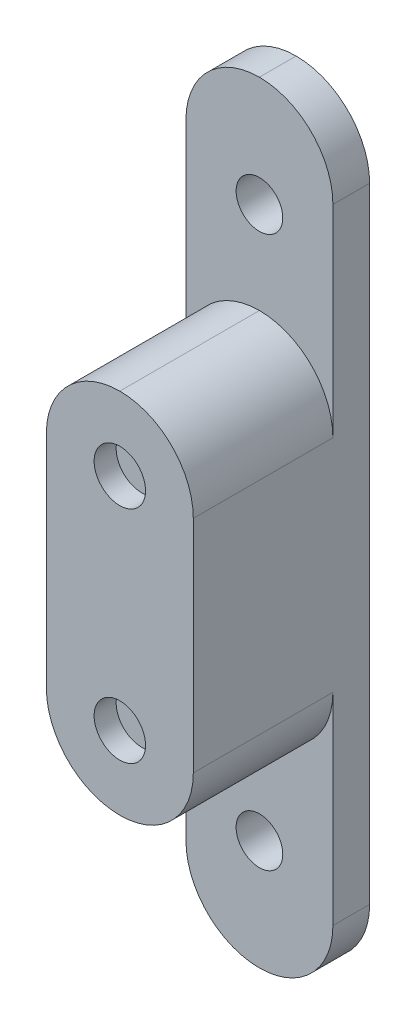
ISO-10303-21;
HEADER;
FILE_DESCRIPTION(('STEP AP214'),'2;1');
FILE_NAME('part.step','',(''),(''),'','','');
FILE_SCHEMA(('AUTOMOTIVE_DESIGN { 1 0 10303 214 1 1 1 1 }'));
ENDSEC;
DATA;
#1=APPLICATION_CONTEXT('core data for automotive mechanical design processes');
#2=APPLICATION_PROTOCOL_DEFINITION('international standard','automotive_design',2000,#1);
#3=PRODUCT_CONTEXT('',#1,'mechanical');
#4=PRODUCT('Part','Part','',(#3));
#5=PRODUCT_RELATED_PRODUCT_CATEGORY('part','',(#4));
#6=PRODUCT_DEFINITION_FORMATION('','',#4);
#7=PRODUCT_DEFINITION_CONTEXT('part definition',#1,'design');
#8=PRODUCT_DEFINITION('design','',#6,#7);
#9=PRODUCT_DEFINITION_SHAPE('','',#8);
#10=(LENGTH_UNIT() NAMED_UNIT(*) SI_UNIT(.MILLI.,.METRE.));
#11=(NAMED_UNIT(*) PLANE_ANGLE_UNIT() SI_UNIT($,.RADIAN.));
#12=(NAMED_UNIT(*) SI_UNIT($,.STERADIAN.) SOLID_ANGLE_UNIT());
#13=UNCERTAINTY_MEASURE_WITH_UNIT(LENGTH_MEASURE(1.E-05),#10,'distance_accuracy_value','');
#14=(GEOMETRIC_REPRESENTATION_CONTEXT(3) GLOBAL_UNCERTAINTY_ASSIGNED_CONTEXT((#13)) GLOBAL_UNIT_ASSIGNED_CONTEXT((#10,
#11,#12)) REPRESENTATION_CONTEXT('',''));
#15=CARTESIAN_POINT('',(0.,0.,0.));
#16=DIRECTION('',(0.,0.,1.));
#17=DIRECTION('',(1.,0.,0.));
#18=AXIS2_PLACEMENT_3D('',#15,#16,#17);
#19=CARTESIAN_POINT('',(0.,0.,5.));
#20=DIRECTION('',(0.,0.,-1.));
#21=DIRECTION('',(-1.,0.,0.));
#22=AXIS2_PLACEMENT_3D('',#19,#20,#21);
#23=PLANE('',#22);
#24=CARTESIAN_POINT('',(0.,37.5,5.));
#25=DIRECTION('',(0.,0.,1.));
#26=DIRECTION('',(1.,0.,0.));
#27=AXIS2_PLACEMENT_3D('',#24,#25,#26);
#28=CIRCLE('',#27,3.175);
#29=CARTESIAN_POINT('',(3.17499999999998,37.5,5.));
#30=VERTEX_POINT('',#29);
#31=EDGE_CURVE('E157',#30,#30,#28,.T.);
#32=ORIENTED_EDGE('',*,*,#31,.F.);
#33=EDGE_LOOP('',(#32));
#34=FACE_BOUND('',#33,.T.);
#35=CARTESIAN_POINT('',(0.,42.5,5.));
#36=DIRECTION('',(0.,0.,-1.));
#37=DIRECTION('',(-1.,0.,0.));
#38=AXIS2_PLACEMENT_3D('',#35,#36,#37);
#39=CIRCLE('',#38,10.);
#40=CARTESIAN_POINT('',(10.,42.5,5.));
#41=VERTEX_POINT('',#40);
#42=CARTESIAN_POINT('',(0.,52.5,5.));
#43=VERTEX_POINT('',#42);
#44=EDGE_CURVE('E194',#41,#43,#39,.F.);
#45=ORIENTED_EDGE('',*,*,#44,.T.);
#46=CARTESIAN_POINT('',(0.,42.5,5.));
#47=DIRECTION('',(0.,0.,-1.));
#48=DIRECTION('',(-1.,0.,0.));
#49=AXIS2_PLACEMENT_3D('',#46,#47,#48);
#50=CIRCLE('',#49,10.);
#51=CARTESIAN_POINT('',(-9.99999999999999,42.5,5.));
#52=VERTEX_POINT('',#51);
#53=EDGE_CURVE('E196',#43,#52,#50,.F.);
#54=ORIENTED_EDGE('',*,*,#53,.T.);
#55=DIRECTION('',(0.,-1.,0.));
#56=VECTOR('',#55,1.);
#57=CARTESIAN_POINT('',(-9.99999999999999,-52.5,5.));
#58=LINE('',#57,#56);
#59=CARTESIAN_POINT('',(-9.99999999999999,15.,5.));
#60=VERTEX_POINT('',#59);
#61=EDGE_CURVE('E160',#52,#60,#58,.T.);
#62=ORIENTED_EDGE('',*,*,#61,.T.);
#63=CARTESIAN_POINT('',(0.,15.,5.));
#64=DIRECTION('',(0.,0.,-1.));
#65=DIRECTION('',(-1.,0.,0.));
#66=AXIS2_PLACEMENT_3D('',#63,#64,#65);
#67=CIRCLE('',#66,10.);
#68=CARTESIAN_POINT('',(0.,25.,5.));
#69=VERTEX_POINT('',#68);
#70=EDGE_CURVE('E11',#60,#69,#67,.T.);
#71=ORIENTED_EDGE('',*,*,#70,.T.);
#72=CARTESIAN_POINT('',(0.,15.,5.));
#73=DIRECTION('',(0.,0.,-1.));
#74=DIRECTION('',(-1.,0.,0.));
#75=AXIS2_PLACEMENT_3D('',#72,#73,#74);
#76=CIRCLE('',#75,10.);
#77=CARTESIAN_POINT('',(10.,15.,5.));
#78=VERTEX_POINT('',#77);
#79=EDGE_CURVE('E42',#69,#78,#76,.T.);
#80=ORIENTED_EDGE('',*,*,#79,.T.);
#81=DIRECTION('',(0.,1.,0.));
#82=VECTOR('',#81,1.);
#83=CARTESIAN_POINT('',(10.,-52.5,5.));
#84=LINE('',#83,#82);
#85=EDGE_CURVE('E154',#78,#41,#84,.T.);
#86=ORIENTED_EDGE('',*,*,#85,.T.);
#87=EDGE_LOOP('',(#45,#54,#62,#71,#80,#86));
#88=FACE_BOUND('',#87,.T.);
#89=ADVANCED_FACE('F33',(#34,#88),#23,.F.);
#90=CARTESIAN_POINT('',(0.,-37.5,5.));
#91=DIRECTION('',(0.,0.,1.));
#92=DIRECTION('',(1.,0.,0.));
#93=AXIS2_PLACEMENT_3D('',#90,#91,#92);
#94=CIRCLE('',#93,3.175);
#95=CARTESIAN_POINT('',(3.175,-37.5,5.));
#96=VERTEX_POINT('',#95);
#97=EDGE_CURVE('E222',#96,#96,#94,.T.);
#98=ORIENTED_EDGE('',*,*,#97,.F.);
#99=EDGE_LOOP('',(#98));
#100=FACE_BOUND('',#99,.T.);
#101=CARTESIAN_POINT('',(0.,-42.5,5.));
#102=DIRECTION('',(0.,0.,-1.));
#103=DIRECTION('',(-1.,0.,0.));
#104=AXIS2_PLACEMENT_3D('',#101,#102,#103);
#105=CIRCLE('',#104,10.);
#106=CARTESIAN_POINT('',(-9.99999999999999,-42.5,5.));
#107=VERTEX_POINT('',#106);
#108=CARTESIAN_POINT('',(0.,-52.5,5.));
#109=VERTEX_POINT('',#108);
#110=EDGE_CURVE('E134',#107,#109,#105,.F.);
#111=ORIENTED_EDGE('',*,*,#110,.T.);
#112=CARTESIAN_POINT('',(0.,-42.5,5.));
#113=DIRECTION('',(0.,0.,-1.));
#114=DIRECTION('',(-1.,0.,0.));
#115=AXIS2_PLACEMENT_3D('',#112,#113,#114);
#116=CIRCLE('',#115,10.);
#117=CARTESIAN_POINT('',(10.,-42.5,5.));
#118=VERTEX_POINT('',#117);
#119=EDGE_CURVE('E174',#109,#118,#116,.F.);
#120=ORIENTED_EDGE('',*,*,#119,.T.);
#121=CARTESIAN_POINT('',(10.,-15.,5.));
#122=VERTEX_POINT('',#121);
#123=EDGE_CURVE('E144',#118,#122,#84,.T.);
#124=ORIENTED_EDGE('',*,*,#123,.T.);
#125=CARTESIAN_POINT('',(0.,-15.,5.));
#126=DIRECTION('',(0.,0.,-1.));
#127=DIRECTION('',(-1.,0.,0.));
#128=AXIS2_PLACEMENT_3D('',#125,#126,#127);
#129=CIRCLE('',#128,10.);
#130=CARTESIAN_POINT('',(0.,-25.,5.));
#131=VERTEX_POINT('',#130);
#132=EDGE_CURVE('E56',#122,#131,#129,.T.);
#133=ORIENTED_EDGE('',*,*,#132,.T.);
#134=CARTESIAN_POINT('',(0.,-15.,5.));
#135=DIRECTION('',(0.,0.,-1.));
#136=DIRECTION('',(-1.,0.,0.));
#137=AXIS2_PLACEMENT_3D('',#134,#135,#136);
#138=CIRCLE('',#137,10.);
#139=CARTESIAN_POINT('',(-9.99999999999999,-15.,5.));
#140=VERTEX_POINT('',#139);
#141=EDGE_CURVE('E199',#131,#140,#138,.T.);
#142=ORIENTED_EDGE('',*,*,#141,.T.);
#143=EDGE_CURVE('E220',#140,#107,#58,.T.);
#144=ORIENTED_EDGE('',*,*,#143,.T.);
#145=EDGE_LOOP('',(#111,#120,#124,#133,#142,#144));
#146=FACE_BOUND('',#145,.T.);
#147=ADVANCED_FACE('F286',(#100,#146),#23,.F.);
#148=CARTESIAN_POINT('',(10.,-52.5,5.));
#149=DIRECTION('',(-1.,0.,0.));
#150=DIRECTION('',(0.,0.,1.));
#151=AXIS2_PLACEMENT_3D('',#148,#149,#150);
#152=PLANE('',#151);
#153=ORIENTED_EDGE('',*,*,#123,.F.);
#154=DIRECTION('',(0.,0.,-1.));
#155=VECTOR('',#154,1.);
#156=CARTESIAN_POINT('',(10.,-42.5,5.));
#157=LINE('',#156,#155);
#158=CARTESIAN_POINT('',(10.,-42.5,0.));
#159=VERTEX_POINT('',#158);
#160=EDGE_CURVE('E128',#118,#159,#157,.T.);
#161=ORIENTED_EDGE('',*,*,#160,.T.);
#162=DIRECTION('',(0.,1.,0.));
#163=VECTOR('',#162,1.);
#164=CARTESIAN_POINT('',(10.,-52.5,0.));
#165=LINE('',#164,#163);
#166=CARTESIAN_POINT('',(10.,42.5,0.));
#167=VERTEX_POINT('',#166);
#168=EDGE_CURVE('E141',#159,#167,#165,.T.);
#169=ORIENTED_EDGE('',*,*,#168,.T.);
#170=DIRECTION('',(0.,0.,-1.));
#171=VECTOR('',#170,1.);
#172=CARTESIAN_POINT('',(10.,42.5,5.));
#173=LINE('',#172,#171);
#174=EDGE_CURVE('E163',#167,#41,#173,.F.);
#175=ORIENTED_EDGE('',*,*,#174,.T.);
#176=ORIENTED_EDGE('',*,*,#85,.F.);
#177=DIRECTION('',(0.,0.,-1.));
#178=VECTOR('',#177,1.);
#179=CARTESIAN_POINT('',(10.,15.,5.));
#180=LINE('',#179,#178);
#181=CARTESIAN_POINT('',(9.99999999999999,15.,24.));
#182=VERTEX_POINT('',#181);
#183=EDGE_CURVE('E165',#78,#182,#180,.F.);
#184=ORIENTED_EDGE('',*,*,#183,.T.);
#185=DIRECTION('',(0.,1.,0.));
#186=VECTOR('',#185,1.);
#187=CARTESIAN_POINT('',(9.99999999999999,25.,24.));
#188=LINE('',#187,#186);
#189=CARTESIAN_POINT('',(9.99999999999999,-15.,24.));
#190=VERTEX_POINT('',#189);
#191=EDGE_CURVE('E226',#190,#182,#188,.T.);
#192=ORIENTED_EDGE('',*,*,#191,.F.);
#193=DIRECTION('',(0.,0.,-1.));
#194=VECTOR('',#193,1.);
#195=CARTESIAN_POINT('',(10.,-15.,5.));
#196=LINE('',#195,#194);
#197=EDGE_CURVE('E146',#190,#122,#196,.T.);
#198=ORIENTED_EDGE('',*,*,#197,.T.);
#199=EDGE_LOOP('',(#153,#161,#169,#175,#176,#184,#192,#198));
#200=FACE_BOUND('',#199,.T.);
#201=ADVANCED_FACE('F140',(#200),#152,.F.);
#202=CARTESIAN_POINT('',(-9.99999999999999,-52.5,5.));
#203=DIRECTION('',(1.,0.,0.));
#204=DIRECTION('',(0.,0.,-1.));
#205=AXIS2_PLACEMENT_3D('',#202,#203,#204);
#206=PLANE('',#205);
#207=DIRECTION('',(0.,-1.,0.));
#208=VECTOR('',#207,1.);
#209=CARTESIAN_POINT('',(-9.99999999999999,-52.5,0.));
#210=LINE('',#209,#208);
#211=CARTESIAN_POINT('',(-9.99999999999999,42.5,0.));
#212=VERTEX_POINT('',#211);
#213=CARTESIAN_POINT('',(-9.99999999999999,-42.5,0.));
#214=VERTEX_POINT('',#213);
#215=EDGE_CURVE('E150',#212,#214,#210,.T.);
#216=ORIENTED_EDGE('',*,*,#215,.T.);
#217=DIRECTION('',(0.,0.,-1.));
#218=VECTOR('',#217,1.);
#219=CARTESIAN_POINT('',(-9.99999999999999,-42.5,5.));
#220=LINE('',#219,#218);
#221=EDGE_CURVE('E184',#214,#107,#220,.F.);
#222=ORIENTED_EDGE('',*,*,#221,.T.);
#223=ORIENTED_EDGE('',*,*,#143,.F.);
#224=DIRECTION('',(0.,0.,-1.));
#225=VECTOR('',#224,1.);
#226=CARTESIAN_POINT('',(-9.99999999999999,-15.,5.));
#227=LINE('',#226,#225);
#228=CARTESIAN_POINT('',(-9.99999999999999,-15.,24.));
#229=VERTEX_POINT('',#228);
#230=EDGE_CURVE('E182',#140,#229,#227,.F.);
#231=ORIENTED_EDGE('',*,*,#230,.T.);
#232=DIRECTION('',(0.,-1.,0.));
#233=VECTOR('',#232,1.);
#234=CARTESIAN_POINT('',(-9.99999999999999,25.,24.));
#235=LINE('',#234,#233);
#236=CARTESIAN_POINT('',(-9.99999999999999,15.,24.));
#237=VERTEX_POINT('',#236);
#238=EDGE_CURVE('E233',#237,#229,#235,.T.);
#239=ORIENTED_EDGE('',*,*,#238,.F.);
#240=DIRECTION('',(0.,0.,-1.));
#241=VECTOR('',#240,1.);
#242=CARTESIAN_POINT('',(-9.99999999999999,15.,5.));
#243=LINE('',#242,#241);
#244=EDGE_CURVE('E179',#237,#60,#243,.T.);
#245=ORIENTED_EDGE('',*,*,#244,.T.);
#246=ORIENTED_EDGE('',*,*,#61,.F.);
#247=DIRECTION('',(0.,0.,-1.));
#248=VECTOR('',#247,1.);
#249=CARTESIAN_POINT('',(-9.99999999999999,42.5,5.));
#250=LINE('',#249,#248);
#251=EDGE_CURVE('E176',#52,#212,#250,.T.);
#252=ORIENTED_EDGE('',*,*,#251,.T.);
#253=EDGE_LOOP('',(#216,#222,#223,#231,#239,#245,#246,#252));
#254=FACE_BOUND('',#253,.T.);
#255=ADVANCED_FACE('F282',(#254),#206,.F.);
#256=CARTESIAN_POINT('',(0.,0.,0.));
#257=DIRECTION('',(0.,0.,-1.));
#258=DIRECTION('',(-1.,0.,0.));
#259=AXIS2_PLACEMENT_3D('',#256,#257,#258);
#260=PLANE('',#259);
#261=CARTESIAN_POINT('',(0.,37.5,0.));
#262=DIRECTION('',(0.,0.,1.));
#263=DIRECTION('',(1.,0.,0.));
#264=AXIS2_PLACEMENT_3D('',#261,#262,#263);
#265=CIRCLE('',#264,3.175);
#266=CARTESIAN_POINT('',(3.17499999999998,37.5,0.));
#267=VERTEX_POINT('',#266);
#268=EDGE_CURVE('E151',#267,#267,#265,.T.);
#269=ORIENTED_EDGE('',*,*,#268,.T.);
#270=EDGE_LOOP('',(#269));
#271=FACE_BOUND('',#270,.T.);
#272=CARTESIAN_POINT('',(0.,-37.5,0.));
#273=DIRECTION('',(0.,0.,1.));
#274=DIRECTION('',(1.,0.,0.));
#275=AXIS2_PLACEMENT_3D('',#272,#273,#274);
#276=CIRCLE('',#275,3.175);
#277=CARTESIAN_POINT('',(3.175,-37.5,0.));
#278=VERTEX_POINT('',#277);
#279=EDGE_CURVE('E225',#278,#278,#276,.T.);
#280=ORIENTED_EDGE('',*,*,#279,.T.);
#281=EDGE_LOOP('',(#280));
#282=FACE_BOUND('',#281,.T.);
#283=ORIENTED_EDGE('',*,*,#168,.F.);
#284=CARTESIAN_POINT('',(0.,-42.5,0.));
#285=DIRECTION('',(0.,0.,-1.));
#286=DIRECTION('',(-1.,0.,0.));
#287=AXIS2_PLACEMENT_3D('',#284,#285,#286);
#288=CIRCLE('',#287,10.);
#289=CARTESIAN_POINT('',(0.,-52.5,0.));
#290=VERTEX_POINT('',#289);
#291=EDGE_CURVE('E124',#159,#290,#288,.T.);
#292=ORIENTED_EDGE('',*,*,#291,.T.);
#293=CARTESIAN_POINT('',(0.,-42.5,0.));
#294=DIRECTION('',(0.,0.,-1.));
#295=DIRECTION('',(-1.,0.,0.));
#296=AXIS2_PLACEMENT_3D('',#293,#294,#295);
#297=CIRCLE('',#296,10.);
#298=EDGE_CURVE('E135',#290,#214,#297,.T.);
#299=ORIENTED_EDGE('',*,*,#298,.T.);
#300=ORIENTED_EDGE('',*,*,#215,.F.);
#301=CARTESIAN_POINT('',(0.,42.5,0.));
#302=DIRECTION('',(0.,0.,-1.));
#303=DIRECTION('',(-1.,0.,0.));
#304=AXIS2_PLACEMENT_3D('',#301,#302,#303);
#305=CIRCLE('',#304,10.);
#306=CARTESIAN_POINT('',(0.,52.5,0.));
#307=VERTEX_POINT('',#306);
#308=EDGE_CURVE('E170',#212,#307,#305,.T.);
#309=ORIENTED_EDGE('',*,*,#308,.T.);
#310=CARTESIAN_POINT('',(0.,42.5,0.));
#311=DIRECTION('',(0.,0.,-1.));
#312=DIRECTION('',(-1.,0.,0.));
#313=AXIS2_PLACEMENT_3D('',#310,#311,#312);
#314=CIRCLE('',#313,10.);
#315=EDGE_CURVE('E145',#307,#167,#314,.T.);
#316=ORIENTED_EDGE('',*,*,#315,.T.);
#317=EDGE_LOOP('',(#283,#292,#299,#300,#309,#316));
#318=FACE_BOUND('',#317,.T.);
#319=ADVANCED_FACE('F148',(#271,#282,#318),#260,.T.);
#320=CARTESIAN_POINT('',(0.,-37.5,0.));
#321=DIRECTION('',(0.,0.,1.));
#322=DIRECTION('',(1.,0.,0.));
#323=AXIS2_PLACEMENT_3D('',#320,#321,#322);
#324=CYLINDRICAL_SURFACE('',#323,3.175);
#325=ORIENTED_EDGE('',*,*,#279,.F.);
#326=EDGE_LOOP('',(#325));
#327=FACE_BOUND('',#326,.T.);
#328=ORIENTED_EDGE('',*,*,#97,.T.);
#329=EDGE_LOOP('',(#328));
#330=FACE_BOUND('',#329,.T.);
#331=ADVANCED_FACE('F299',(#327,#330),#324,.F.);
#332=CARTESIAN_POINT('',(0.,37.5,0.));
#333=DIRECTION('',(0.,0.,1.));
#334=DIRECTION('',(1.,0.,0.));
#335=AXIS2_PLACEMENT_3D('',#332,#333,#334);
#336=CYLINDRICAL_SURFACE('',#335,3.175);
#337=ORIENTED_EDGE('',*,*,#268,.F.);
#338=EDGE_LOOP('',(#337));
#339=FACE_BOUND('',#338,.T.);
#340=ORIENTED_EDGE('',*,*,#31,.T.);
#341=EDGE_LOOP('',(#340));
#342=FACE_BOUND('',#341,.T.);
#343=ADVANCED_FACE('F261',(#339,#342),#336,.F.);
#344=CARTESIAN_POINT('',(0.,0.,24.));
#345=DIRECTION('',(0.,0.,-1.));
#346=DIRECTION('',(-1.,0.,0.));
#347=AXIS2_PLACEMENT_3D('',#344,#345,#346);
#348=PLANE('',#347);
#349=CARTESIAN_POINT('',(0.,-15.,24.));
#350=DIRECTION('',(0.,0.,1.));
#351=DIRECTION('',(1.,0.,0.));
#352=AXIS2_PLACEMENT_3D('',#349,#350,#351);
#353=CIRCLE('',#352,3.5);
#354=CARTESIAN_POINT('',(3.5,-15.,24.));
#355=VERTEX_POINT('',#354);
#356=EDGE_CURVE('E242',#355,#355,#353,.T.);
#357=ORIENTED_EDGE('',*,*,#356,.F.);
#358=EDGE_LOOP('',(#357));
#359=FACE_BOUND('',#358,.T.);
#360=CARTESIAN_POINT('',(0.,15.,24.));
#361=DIRECTION('',(0.,0.,1.));
#362=DIRECTION('',(1.,0.,0.));
#363=AXIS2_PLACEMENT_3D('',#360,#361,#362);
#364=CIRCLE('',#363,3.5);
#365=CARTESIAN_POINT('',(3.49999999999999,15.,24.));
#366=VERTEX_POINT('',#365);
#367=EDGE_CURVE('E203',#366,#366,#364,.T.);
#368=ORIENTED_EDGE('',*,*,#367,.F.);
#369=EDGE_LOOP('',(#368));
#370=FACE_BOUND('',#369,.T.);
#371=CARTESIAN_POINT('',(0.,-15.,24.));
#372=DIRECTION('',(0.,0.,-1.));
#373=DIRECTION('',(-1.,0.,0.));
#374=AXIS2_PLACEMENT_3D('',#371,#372,#373);
#375=CIRCLE('',#374,10.);
#376=CARTESIAN_POINT('',(0.,-25.,24.));
#377=VERTEX_POINT('',#376);
#378=EDGE_CURVE('E190',#229,#377,#375,.F.);
#379=ORIENTED_EDGE('',*,*,#378,.T.);
#380=CARTESIAN_POINT('',(0.,-15.,24.));
#381=DIRECTION('',(0.,0.,-1.));
#382=DIRECTION('',(-1.,0.,0.));
#383=AXIS2_PLACEMENT_3D('',#380,#381,#382);
#384=CIRCLE('',#383,10.);
#385=EDGE_CURVE('E192',#377,#190,#384,.F.);
#386=ORIENTED_EDGE('',*,*,#385,.T.);
#387=ORIENTED_EDGE('',*,*,#191,.T.);
#388=CARTESIAN_POINT('',(0.,15.,24.));
#389=DIRECTION('',(0.,0.,-1.));
#390=DIRECTION('',(-1.,0.,0.));
#391=AXIS2_PLACEMENT_3D('',#388,#389,#390);
#392=CIRCLE('',#391,10.);
#393=CARTESIAN_POINT('',(0.,25.,24.));
#394=VERTEX_POINT('',#393);
#395=EDGE_CURVE('E188',#182,#394,#392,.F.);
#396=ORIENTED_EDGE('',*,*,#395,.T.);
#397=CARTESIAN_POINT('',(0.,15.,24.));
#398=DIRECTION('',(0.,0.,-1.));
#399=DIRECTION('',(-1.,0.,0.));
#400=AXIS2_PLACEMENT_3D('',#397,#398,#399);
#401=CIRCLE('',#400,10.);
#402=EDGE_CURVE('E186',#394,#237,#401,.F.);
#403=ORIENTED_EDGE('',*,*,#402,.T.);
#404=ORIENTED_EDGE('',*,*,#238,.T.);
#405=EDGE_LOOP('',(#379,#386,#387,#396,#403,#404));
#406=FACE_BOUND('',#405,.T.);
#407=ADVANCED_FACE('F257',(#359,#370,#406),#348,.F.);
#408=CARTESIAN_POINT('',(0.,15.,21.));
#409=DIRECTION('',(0.,0.,1.));
#410=DIRECTION('',(1.,0.,0.));
#411=AXIS2_PLACEMENT_3D('',#408,#409,#410);
#412=CYLINDRICAL_SURFACE('',#411,3.5);
#413=CARTESIAN_POINT('',(0.,15.,21.));
#414=DIRECTION('',(0.,0.,1.));
#415=DIRECTION('',(1.,0.,0.));
#416=AXIS2_PLACEMENT_3D('',#413,#414,#415);
#417=CIRCLE('',#416,3.5);
#418=CARTESIAN_POINT('',(3.49999999999999,15.,21.));
#419=VERTEX_POINT('',#418);
#420=EDGE_CURVE('E239',#419,#419,#417,.T.);
#421=ORIENTED_EDGE('',*,*,#420,.F.);
#422=EDGE_LOOP('',(#421));
#423=FACE_BOUND('',#422,.T.);
#424=ORIENTED_EDGE('',*,*,#367,.T.);
#425=EDGE_LOOP('',(#424));
#426=FACE_BOUND('',#425,.T.);
#427=ADVANCED_FACE('F260',(#423,#426),#412,.F.);
#428=CARTESIAN_POINT('',(0.,15.,21.));
#429=DIRECTION('',(0.,0.,1.));
#430=DIRECTION('',(1.,0.,0.));
#431=AXIS2_PLACEMENT_3D('',#428,#429,#430);
#432=PLANE('',#431);
#433=ORIENTED_EDGE('',*,*,#420,.T.);
#434=EDGE_LOOP('',(#433));
#435=FACE_BOUND('',#434,.T.);
#436=ADVANCED_FACE('F253',(#435),#432,.T.);
#437=CARTESIAN_POINT('',(0.,-15.,21.));
#438=DIRECTION('',(0.,0.,1.));
#439=DIRECTION('',(1.,0.,0.));
#440=AXIS2_PLACEMENT_3D('',#437,#438,#439);
#441=CYLINDRICAL_SURFACE('',#440,3.5);
#442=CARTESIAN_POINT('',(0.,-15.,21.));
#443=DIRECTION('',(0.,0.,1.));
#444=DIRECTION('',(1.,0.,0.));
#445=AXIS2_PLACEMENT_3D('',#442,#443,#444);
#446=CIRCLE('',#445,3.5);
#447=CARTESIAN_POINT('',(3.5,-15.,21.));
#448=VERTEX_POINT('',#447);
#449=EDGE_CURVE('E236',#448,#448,#446,.T.);
#450=ORIENTED_EDGE('',*,*,#449,.F.);
#451=EDGE_LOOP('',(#450));
#452=FACE_BOUND('',#451,.T.);
#453=ORIENTED_EDGE('',*,*,#356,.T.);
#454=EDGE_LOOP('',(#453));
#455=FACE_BOUND('',#454,.T.);
#456=ADVANCED_FACE('F250',(#452,#455),#441,.F.);
#457=CARTESIAN_POINT('',(0.,-15.,21.));
#458=DIRECTION('',(0.,0.,1.));
#459=DIRECTION('',(1.,0.,0.));
#460=AXIS2_PLACEMENT_3D('',#457,#458,#459);
#461=PLANE('',#460);
#462=ORIENTED_EDGE('',*,*,#449,.T.);
#463=EDGE_LOOP('',(#462));
#464=FACE_BOUND('',#463,.T.);
#465=ADVANCED_FACE('F248',(#464),#461,.T.);
#466=CARTESIAN_POINT('',(0.,-42.5,5.));
#467=DIRECTION('',(0.,0.,-1.));
#468=DIRECTION('',(-1.,0.,0.));
#469=AXIS2_PLACEMENT_3D('',#466,#467,#468);
#470=CYLINDRICAL_SURFACE('',#469,10.);
#471=DIRECTION('',(0.,0.,-1.));
#472=VECTOR('',#471,1.);
#473=CARTESIAN_POINT('',(0.,-52.5,5.));
#474=LINE('',#473,#472);
#475=EDGE_CURVE('E130',#109,#290,#474,.T.);
#476=ORIENTED_EDGE('',*,*,#475,.F.);
#477=ORIENTED_EDGE('',*,*,#110,.F.);
#478=ORIENTED_EDGE('',*,*,#221,.F.);
#479=ORIENTED_EDGE('',*,*,#298,.F.);
#480=EDGE_LOOP('',(#476,#477,#478,#479));
#481=FACE_BOUND('',#480,.T.);
#482=ADVANCED_FACE('F308',(#481),#470,.T.);
#483=CARTESIAN_POINT('',(0.,-42.5,5.));
#484=DIRECTION('',(0.,0.,-1.));
#485=DIRECTION('',(-1.,0.,0.));
#486=AXIS2_PLACEMENT_3D('',#483,#484,#485);
#487=CYLINDRICAL_SURFACE('',#486,10.);
#488=ORIENTED_EDGE('',*,*,#119,.F.);
#489=ORIENTED_EDGE('',*,*,#475,.T.);
#490=ORIENTED_EDGE('',*,*,#291,.F.);
#491=ORIENTED_EDGE('',*,*,#160,.F.);
#492=EDGE_LOOP('',(#488,#489,#490,#491));
#493=FACE_BOUND('',#492,.T.);
#494=ADVANCED_FACE('F127',(#493),#487,.T.);
#495=CARTESIAN_POINT('',(0.,-15.,24.));
#496=DIRECTION('',(0.,0.,-1.));
#497=DIRECTION('',(-1.,0.,0.));
#498=AXIS2_PLACEMENT_3D('',#495,#496,#497);
#499=CYLINDRICAL_SURFACE('',#498,10.);
#500=DIRECTION('',(0.,0.,-1.));
#501=VECTOR('',#500,1.);
#502=CARTESIAN_POINT('',(0.,-25.,24.));
#503=LINE('',#502,#501);
#504=EDGE_CURVE('E204',#377,#131,#503,.T.);
#505=ORIENTED_EDGE('',*,*,#504,.F.);
#506=ORIENTED_EDGE('',*,*,#378,.F.);
#507=ORIENTED_EDGE('',*,*,#230,.F.);
#508=ORIENTED_EDGE('',*,*,#141,.F.);
#509=EDGE_LOOP('',(#505,#506,#507,#508));
#510=FACE_BOUND('',#509,.T.);
#511=ADVANCED_FACE('F272',(#510),#499,.T.);
#512=CARTESIAN_POINT('',(0.,-15.,5.));
#513=DIRECTION('',(0.,0.,-1.));
#514=DIRECTION('',(-1.,0.,0.));
#515=AXIS2_PLACEMENT_3D('',#512,#513,#514);
#516=CYLINDRICAL_SURFACE('',#515,10.);
#517=ORIENTED_EDGE('',*,*,#385,.F.);
#518=ORIENTED_EDGE('',*,*,#504,.T.);
#519=ORIENTED_EDGE('',*,*,#132,.F.);
#520=ORIENTED_EDGE('',*,*,#197,.F.);
#521=EDGE_LOOP('',(#517,#518,#519,#520));
#522=FACE_BOUND('',#521,.T.);
#523=ADVANCED_FACE('F275',(#522),#516,.T.);
#524=CARTESIAN_POINT('',(0.,15.,5.));
#525=DIRECTION('',(0.,0.,-1.));
#526=DIRECTION('',(-1.,0.,0.));
#527=AXIS2_PLACEMENT_3D('',#524,#525,#526);
#528=CYLINDRICAL_SURFACE('',#527,10.);
#529=ORIENTED_EDGE('',*,*,#244,.F.);
#530=ORIENTED_EDGE('',*,*,#402,.F.);
#531=DIRECTION('',(0.,0.,-1.));
#532=VECTOR('',#531,1.);
#533=CARTESIAN_POINT('',(0.,25.,24.));
#534=LINE('',#533,#532);
#535=EDGE_CURVE('E206',#69,#394,#534,.F.);
#536=ORIENTED_EDGE('',*,*,#535,.F.);
#537=ORIENTED_EDGE('',*,*,#70,.F.);
#538=EDGE_LOOP('',(#529,#530,#536,#537));
#539=FACE_BOUND('',#538,.T.);
#540=ADVANCED_FACE('F279',(#539),#528,.T.);
#541=CARTESIAN_POINT('',(0.,15.,24.));
#542=DIRECTION('',(0.,0.,-1.));
#543=DIRECTION('',(-1.,0.,0.));
#544=AXIS2_PLACEMENT_3D('',#541,#542,#543);
#545=CYLINDRICAL_SURFACE('',#544,10.);
#546=ORIENTED_EDGE('',*,*,#395,.F.);
#547=ORIENTED_EDGE('',*,*,#183,.F.);
#548=ORIENTED_EDGE('',*,*,#79,.F.);
#549=ORIENTED_EDGE('',*,*,#535,.T.);
#550=EDGE_LOOP('',(#546,#547,#548,#549));
#551=FACE_BOUND('',#550,.T.);
#552=ADVANCED_FACE('F316',(#551),#545,.T.);
#553=CARTESIAN_POINT('',(0.,42.5,5.));
#554=DIRECTION('',(0.,0.,-1.));
#555=DIRECTION('',(-1.,0.,0.));
#556=AXIS2_PLACEMENT_3D('',#553,#554,#555);
#557=CYLINDRICAL_SURFACE('',#556,10.);
#558=DIRECTION('',(0.,0.,-1.));
#559=VECTOR('',#558,1.);
#560=CARTESIAN_POINT('',(0.,52.5,5.));
#561=LINE('',#560,#559);
#562=EDGE_CURVE('E37',#43,#307,#561,.T.);
#563=ORIENTED_EDGE('',*,*,#562,.F.);
#564=ORIENTED_EDGE('',*,*,#44,.F.);
#565=ORIENTED_EDGE('',*,*,#174,.F.);
#566=ORIENTED_EDGE('',*,*,#315,.F.);
#567=EDGE_LOOP('',(#563,#564,#565,#566));
#568=FACE_BOUND('',#567,.T.);
#569=ADVANCED_FACE('F35',(#568),#557,.T.);
#570=CARTESIAN_POINT('',(0.,42.5,5.));
#571=DIRECTION('',(0.,0.,-1.));
#572=DIRECTION('',(-1.,0.,0.));
#573=AXIS2_PLACEMENT_3D('',#570,#571,#572);
#574=CYLINDRICAL_SURFACE('',#573,10.);
#575=ORIENTED_EDGE('',*,*,#53,.F.);
#576=ORIENTED_EDGE('',*,*,#562,.T.);
#577=ORIENTED_EDGE('',*,*,#308,.F.);
#578=ORIENTED_EDGE('',*,*,#251,.F.);
#579=EDGE_LOOP('',(#575,#576,#577,#578));
#580=FACE_BOUND('',#579,.T.);
#581=ADVANCED_FACE('F214',(#580),#574,.T.);
#582=CLOSED_SHELL('',(#89,#147,#201,#255,#319,#331,#343,#407,#427,#436,#456,#465,#482,#494,#511,
#523,#540,#552,#569,#581));
#583=MANIFOLD_SOLID_BREP('B2',#582);
#584=ADVANCED_BREP_SHAPE_REPRESENTATION('',(#18,#583),#14);
#585=SHAPE_DEFINITION_REPRESENTATION(#9,#584);
ENDSEC;
END-ISO-10303-21;
